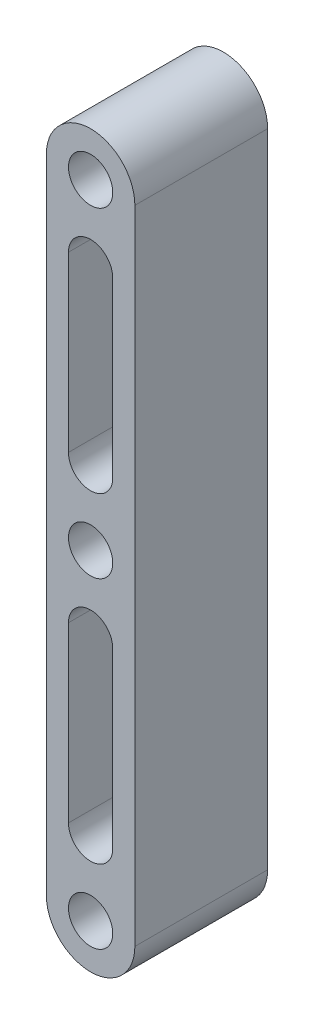
ISO-10303-21;
HEADER;
FILE_DESCRIPTION(('STEP AP214'),'2;1');
FILE_NAME('part.step','',(''),(''),'','','');
FILE_SCHEMA(('AUTOMOTIVE_DESIGN { 1 0 10303 214 1 1 1 1 }'));
ENDSEC;
DATA;
#1=APPLICATION_CONTEXT('core data for automotive mechanical design processes');
#2=APPLICATION_PROTOCOL_DEFINITION('international standard','automotive_design',2000,#1);
#3=PRODUCT_CONTEXT('',#1,'mechanical');
#4=PRODUCT('Part','Part','',(#3));
#5=PRODUCT_RELATED_PRODUCT_CATEGORY('part','',(#4));
#6=PRODUCT_DEFINITION_FORMATION('','',#4);
#7=PRODUCT_DEFINITION_CONTEXT('part definition',#1,'design');
#8=PRODUCT_DEFINITION('design','',#6,#7);
#9=PRODUCT_DEFINITION_SHAPE('','',#8);
#10=(LENGTH_UNIT() NAMED_UNIT(*) SI_UNIT(.MILLI.,.METRE.));
#11=(NAMED_UNIT(*) PLANE_ANGLE_UNIT() SI_UNIT($,.RADIAN.));
#12=(NAMED_UNIT(*) SI_UNIT($,.STERADIAN.) SOLID_ANGLE_UNIT());
#13=UNCERTAINTY_MEASURE_WITH_UNIT(LENGTH_MEASURE(1.E-05),#10,'distance_accuracy_value','');
#14=(GEOMETRIC_REPRESENTATION_CONTEXT(3) GLOBAL_UNCERTAINTY_ASSIGNED_CONTEXT((#13)) GLOBAL_UNIT_ASSIGNED_CONTEXT((#10,
#11,#12)) REPRESENTATION_CONTEXT('',''));
#15=CARTESIAN_POINT('',(0.,0.,0.));
#16=DIRECTION('',(0.,0.,1.));
#17=DIRECTION('',(1.,0.,0.));
#18=AXIS2_PLACEMENT_3D('',#15,#16,#17);
#19=CARTESIAN_POINT('',(0.,0.,9.));
#20=DIRECTION('',(0.,0.,1.));
#21=DIRECTION('',(1.,0.,0.));
#22=AXIS2_PLACEMENT_3D('',#19,#20,#21);
#23=PLANE('',#22);
#24=CARTESIAN_POINT('',(0.,0.,9.));
#25=DIRECTION('',(0.,0.,1.));
#26=DIRECTION('',(1.,0.,0.));
#27=AXIS2_PLACEMENT_3D('',#24,#25,#26);
#28=CIRCLE('',#27,3.);
#29=CARTESIAN_POINT('',(3.,0.,9.));
#30=VERTEX_POINT('',#29);
#31=EDGE_CURVE('E205',#30,#30,#28,.T.);
#32=ORIENTED_EDGE('',*,*,#31,.F.);
#33=EDGE_LOOP('',(#32));
#34=FACE_BOUND('',#33,.T.);
#35=CARTESIAN_POINT('',(0.,0.,9.));
#36=DIRECTION('',(0.,0.,1.));
#37=DIRECTION('',(1.,0.,0.));
#38=AXIS2_PLACEMENT_3D('',#35,#36,#37);
#39=CIRCLE('',#38,6.);
#40=CARTESIAN_POINT('',(6.,0.,9.));
#41=VERTEX_POINT('',#40);
#42=CARTESIAN_POINT('',(-6.,0.,9.));
#43=VERTEX_POINT('',#42);
#44=EDGE_CURVE('E217',#41,#43,#39,.T.);
#45=ORIENTED_EDGE('',*,*,#44,.T.);
#46=DIRECTION('',(0.,-1.,0.));
#47=VECTOR('',#46,1.);
#48=CARTESIAN_POINT('',(-6.,0.,9.));
#49=LINE('',#48,#47);
#50=CARTESIAN_POINT('',(-6.,-87.,9.));
#51=VERTEX_POINT('',#50);
#52=EDGE_CURVE('E220',#43,#51,#49,.T.);
#53=ORIENTED_EDGE('',*,*,#52,.T.);
#54=CARTESIAN_POINT('',(0.,-87.,9.));
#55=DIRECTION('',(0.,0.,1.));
#56=DIRECTION('',(1.,0.,0.));
#57=AXIS2_PLACEMENT_3D('',#54,#55,#56);
#58=CIRCLE('',#57,6.);
#59=CARTESIAN_POINT('',(6.00000000000001,-87.,9.));
#60=VERTEX_POINT('',#59);
#61=EDGE_CURVE('E223',#51,#60,#58,.T.);
#62=ORIENTED_EDGE('',*,*,#61,.T.);
#63=DIRECTION('',(0.,1.,0.));
#64=VECTOR('',#63,1.);
#65=CARTESIAN_POINT('',(6.,0.,9.));
#66=LINE('',#65,#64);
#67=EDGE_CURVE('E225',#60,#41,#66,.T.);
#68=ORIENTED_EDGE('',*,*,#67,.T.);
#69=EDGE_LOOP('',(#45,#53,#62,#68));
#70=FACE_BOUND('',#69,.T.);
#71=CARTESIAN_POINT('',(0.,-87.,9.));
#72=DIRECTION('',(0.,0.,1.));
#73=DIRECTION('',(1.,0.,0.));
#74=AXIS2_PLACEMENT_3D('',#71,#72,#73);
#75=CIRCLE('',#74,3.);
#76=CARTESIAN_POINT('',(3.00000000000001,-87.,9.));
#77=VERTEX_POINT('',#76);
#78=EDGE_CURVE('E211',#77,#77,#75,.T.);
#79=ORIENTED_EDGE('',*,*,#78,.F.);
#80=EDGE_LOOP('',(#79));
#81=FACE_BOUND('',#80,.T.);
#82=CARTESIAN_POINT('',(0.,-43.5,9.));
#83=DIRECTION('',(0.,0.,1.));
#84=DIRECTION('',(1.,0.,0.));
#85=AXIS2_PLACEMENT_3D('',#82,#83,#84);
#86=CIRCLE('',#85,3.);
#87=CARTESIAN_POINT('',(3.00000000000001,-43.5,9.));
#88=VERTEX_POINT('',#87);
#89=EDGE_CURVE('E199',#88,#88,#86,.T.);
#90=ORIENTED_EDGE('',*,*,#89,.F.);
#91=EDGE_LOOP('',(#90));
#92=FACE_BOUND('',#91,.T.);
#93=DIRECTION('',(0.,-1.,0.));
#94=VECTOR('',#93,1.);
#95=CARTESIAN_POINT('',(-3.,-10.,9.));
#96=LINE('',#95,#94);
#97=CARTESIAN_POINT('',(-3.,-10.,9.));
#98=VERTEX_POINT('',#97);
#99=CARTESIAN_POINT('',(-3.,-33.5,9.));
#100=VERTEX_POINT('',#99);
#101=EDGE_CURVE('E170',#98,#100,#96,.T.);
#102=ORIENTED_EDGE('',*,*,#101,.F.);
#103=CARTESIAN_POINT('',(0.,-10.,9.));
#104=DIRECTION('',(0.,0.,1.));
#105=DIRECTION('',(1.,0.,0.));
#106=AXIS2_PLACEMENT_3D('',#103,#104,#105);
#107=CIRCLE('',#106,3.);
#108=CARTESIAN_POINT('',(3.,-10.,9.));
#109=VERTEX_POINT('',#108);
#110=EDGE_CURVE('E168',#109,#98,#107,.T.);
#111=ORIENTED_EDGE('',*,*,#110,.F.);
#112=DIRECTION('',(0.,1.,0.));
#113=VECTOR('',#112,1.);
#114=CARTESIAN_POINT('',(3.,-10.,9.));
#115=LINE('',#114,#113);
#116=CARTESIAN_POINT('',(3.,-33.5,9.));
#117=VERTEX_POINT('',#116);
#118=EDGE_CURVE('E176',#117,#109,#115,.T.);
#119=ORIENTED_EDGE('',*,*,#118,.F.);
#120=CARTESIAN_POINT('',(0.,-33.5,9.));
#121=DIRECTION('',(0.,0.,1.));
#122=DIRECTION('',(1.,0.,0.));
#123=AXIS2_PLACEMENT_3D('',#120,#121,#122);
#124=CIRCLE('',#123,3.);
#125=EDGE_CURVE('E173',#100,#117,#124,.T.);
#126=ORIENTED_EDGE('',*,*,#125,.F.);
#127=EDGE_LOOP('',(#102,#111,#119,#126));
#128=FACE_BOUND('',#127,.T.);
#129=DIRECTION('',(0.,-1.,0.));
#130=VECTOR('',#129,1.);
#131=CARTESIAN_POINT('',(-2.99999999999999,-53.5,9.));
#132=LINE('',#131,#130);
#133=CARTESIAN_POINT('',(-2.99999999999999,-53.5,9.));
#134=VERTEX_POINT('',#133);
#135=CARTESIAN_POINT('',(-2.99999999999999,-77.,9.));
#136=VERTEX_POINT('',#135);
#137=EDGE_CURVE('E140',#134,#136,#132,.T.);
#138=ORIENTED_EDGE('',*,*,#137,.F.);
#139=CARTESIAN_POINT('',(0.,-53.5,9.));
#140=DIRECTION('',(0.,0.,1.));
#141=DIRECTION('',(1.,0.,0.));
#142=AXIS2_PLACEMENT_3D('',#139,#140,#141);
#143=CIRCLE('',#142,3.);
#144=CARTESIAN_POINT('',(3.00000000000001,-53.5,9.));
#145=VERTEX_POINT('',#144);
#146=EDGE_CURVE('E132',#145,#134,#143,.T.);
#147=ORIENTED_EDGE('',*,*,#146,.F.);
#148=DIRECTION('',(0.,1.,0.));
#149=VECTOR('',#148,1.);
#150=CARTESIAN_POINT('',(3.00000000000001,-53.5,9.));
#151=LINE('',#150,#149);
#152=CARTESIAN_POINT('',(3.00000000000001,-77.,9.));
#153=VERTEX_POINT('',#152);
#154=EDGE_CURVE('E154',#153,#145,#151,.T.);
#155=ORIENTED_EDGE('',*,*,#154,.F.);
#156=CARTESIAN_POINT('',(0.,-77.,9.));
#157=DIRECTION('',(0.,0.,1.));
#158=DIRECTION('',(1.,0.,0.));
#159=AXIS2_PLACEMENT_3D('',#156,#157,#158);
#160=CIRCLE('',#159,3.);
#161=EDGE_CURVE('E152',#136,#153,#160,.T.);
#162=ORIENTED_EDGE('',*,*,#161,.F.);
#163=EDGE_LOOP('',(#138,#147,#155,#162));
#164=FACE_BOUND('',#163,.T.);
#165=ADVANCED_FACE('F43',(#34,#70,#81,#92,#128,#164),#23,.T.);
#166=CARTESIAN_POINT('',(0.,0.,-9.));
#167=DIRECTION('',(0.,0.,1.));
#168=DIRECTION('',(1.,0.,0.));
#169=AXIS2_PLACEMENT_3D('',#166,#167,#168);
#170=PLANE('',#169);
#171=CARTESIAN_POINT('',(0.,-10.,-9.));
#172=DIRECTION('',(0.,0.,1.));
#173=DIRECTION('',(1.,0.,0.));
#174=AXIS2_PLACEMENT_3D('',#171,#172,#173);
#175=CIRCLE('',#174,3.);
#176=CARTESIAN_POINT('',(3.,-10.,-9.));
#177=VERTEX_POINT('',#176);
#178=CARTESIAN_POINT('',(-3.,-10.,-9.));
#179=VERTEX_POINT('',#178);
#180=EDGE_CURVE('E148',#177,#179,#175,.T.);
#181=ORIENTED_EDGE('',*,*,#180,.T.);
#182=DIRECTION('',(0.,-1.,0.));
#183=VECTOR('',#182,1.);
#184=CARTESIAN_POINT('',(-3.,-10.,-9.));
#185=LINE('',#184,#183);
#186=CARTESIAN_POINT('',(-3.,-33.5,-9.));
#187=VERTEX_POINT('',#186);
#188=EDGE_CURVE('E181',#179,#187,#185,.T.);
#189=ORIENTED_EDGE('',*,*,#188,.T.);
#190=CARTESIAN_POINT('',(0.,-33.5,-9.));
#191=DIRECTION('',(0.,0.,1.));
#192=DIRECTION('',(1.,0.,0.));
#193=AXIS2_PLACEMENT_3D('',#190,#191,#192);
#194=CIRCLE('',#193,3.);
#195=CARTESIAN_POINT('',(3.,-33.5,-9.));
#196=VERTEX_POINT('',#195);
#197=EDGE_CURVE('E184',#187,#196,#194,.T.);
#198=ORIENTED_EDGE('',*,*,#197,.T.);
#199=DIRECTION('',(0.,1.,0.));
#200=VECTOR('',#199,1.);
#201=CARTESIAN_POINT('',(3.,-10.,-9.));
#202=LINE('',#201,#200);
#203=EDGE_CURVE('E171',#196,#177,#202,.T.);
#204=ORIENTED_EDGE('',*,*,#203,.T.);
#205=EDGE_LOOP('',(#181,#189,#198,#204));
#206=FACE_BOUND('',#205,.T.);
#207=CARTESIAN_POINT('',(0.,0.,-9.));
#208=DIRECTION('',(0.,0.,1.));
#209=DIRECTION('',(1.,0.,0.));
#210=AXIS2_PLACEMENT_3D('',#207,#208,#209);
#211=CIRCLE('',#210,6.);
#212=CARTESIAN_POINT('',(6.,0.,-9.));
#213=VERTEX_POINT('',#212);
#214=CARTESIAN_POINT('',(-6.,0.,-9.));
#215=VERTEX_POINT('',#214);
#216=EDGE_CURVE('E214',#213,#215,#211,.T.);
#217=ORIENTED_EDGE('',*,*,#216,.F.);
#218=DIRECTION('',(0.,1.,0.));
#219=VECTOR('',#218,1.);
#220=CARTESIAN_POINT('',(6.,0.,-9.));
#221=LINE('',#220,#219);
#222=CARTESIAN_POINT('',(6.00000000000001,-87.,-9.));
#223=VERTEX_POINT('',#222);
#224=EDGE_CURVE('E221',#223,#213,#221,.T.);
#225=ORIENTED_EDGE('',*,*,#224,.F.);
#226=CARTESIAN_POINT('',(0.,-87.,-9.));
#227=DIRECTION('',(0.,0.,1.));
#228=DIRECTION('',(1.,0.,0.));
#229=AXIS2_PLACEMENT_3D('',#226,#227,#228);
#230=CIRCLE('',#229,6.);
#231=CARTESIAN_POINT('',(-6.,-87.,-9.));
#232=VERTEX_POINT('',#231);
#233=EDGE_CURVE('E232',#232,#223,#230,.T.);
#234=ORIENTED_EDGE('',*,*,#233,.F.);
#235=DIRECTION('',(0.,-1.,0.));
#236=VECTOR('',#235,1.);
#237=CARTESIAN_POINT('',(-6.,0.,-9.));
#238=LINE('',#237,#236);
#239=EDGE_CURVE('E230',#215,#232,#238,.T.);
#240=ORIENTED_EDGE('',*,*,#239,.F.);
#241=EDGE_LOOP('',(#217,#225,#234,#240));
#242=FACE_BOUND('',#241,.T.);
#243=CARTESIAN_POINT('',(0.,-87.,-9.));
#244=DIRECTION('',(0.,0.,1.));
#245=DIRECTION('',(1.,0.,0.));
#246=AXIS2_PLACEMENT_3D('',#243,#244,#245);
#247=CIRCLE('',#246,3.);
#248=CARTESIAN_POINT('',(3.00000000000001,-87.,-9.));
#249=VERTEX_POINT('',#248);
#250=EDGE_CURVE('E208',#249,#249,#247,.T.);
#251=ORIENTED_EDGE('',*,*,#250,.T.);
#252=EDGE_LOOP('',(#251));
#253=FACE_BOUND('',#252,.T.);
#254=CARTESIAN_POINT('',(0.,0.,-9.));
#255=DIRECTION('',(0.,0.,1.));
#256=DIRECTION('',(1.,0.,0.));
#257=AXIS2_PLACEMENT_3D('',#254,#255,#256);
#258=CIRCLE('',#257,3.);
#259=CARTESIAN_POINT('',(3.,0.,-9.));
#260=VERTEX_POINT('',#259);
#261=EDGE_CURVE('E202',#260,#260,#258,.T.);
#262=ORIENTED_EDGE('',*,*,#261,.T.);
#263=EDGE_LOOP('',(#262));
#264=FACE_BOUND('',#263,.T.);
#265=CARTESIAN_POINT('',(0.,-43.5,-9.));
#266=DIRECTION('',(0.,0.,1.));
#267=DIRECTION('',(1.,0.,0.));
#268=AXIS2_PLACEMENT_3D('',#265,#266,#267);
#269=CIRCLE('',#268,3.);
#270=CARTESIAN_POINT('',(3.00000000000001,-43.5,-9.));
#271=VERTEX_POINT('',#270);
#272=EDGE_CURVE('E198',#271,#271,#269,.T.);
#273=ORIENTED_EDGE('',*,*,#272,.T.);
#274=EDGE_LOOP('',(#273));
#275=FACE_BOUND('',#274,.T.);
#276=CARTESIAN_POINT('',(0.,-53.5,-9.));
#277=DIRECTION('',(0.,0.,1.));
#278=DIRECTION('',(1.,0.,0.));
#279=AXIS2_PLACEMENT_3D('',#276,#277,#278);
#280=CIRCLE('',#279,3.);
#281=CARTESIAN_POINT('',(3.00000000000001,-53.5,-9.));
#282=VERTEX_POINT('',#281);
#283=CARTESIAN_POINT('',(-2.99999999999999,-53.5,-9.));
#284=VERTEX_POINT('',#283);
#285=EDGE_CURVE('E66',#282,#284,#280,.T.);
#286=ORIENTED_EDGE('',*,*,#285,.T.);
#287=DIRECTION('',(0.,-1.,0.));
#288=VECTOR('',#287,1.);
#289=CARTESIAN_POINT('',(-2.99999999999999,-53.5,-9.));
#290=LINE('',#289,#288);
#291=CARTESIAN_POINT('',(-2.99999999999999,-77.,-9.));
#292=VERTEX_POINT('',#291);
#293=EDGE_CURVE('E147',#284,#292,#290,.T.);
#294=ORIENTED_EDGE('',*,*,#293,.T.);
#295=CARTESIAN_POINT('',(0.,-77.,-9.));
#296=DIRECTION('',(0.,0.,1.));
#297=DIRECTION('',(1.,0.,0.));
#298=AXIS2_PLACEMENT_3D('',#295,#296,#297);
#299=CIRCLE('',#298,3.);
#300=CARTESIAN_POINT('',(3.00000000000001,-77.,-9.));
#301=VERTEX_POINT('',#300);
#302=EDGE_CURVE('E160',#292,#301,#299,.T.);
#303=ORIENTED_EDGE('',*,*,#302,.T.);
#304=DIRECTION('',(0.,1.,0.));
#305=VECTOR('',#304,1.);
#306=CARTESIAN_POINT('',(3.00000000000001,-53.5,-9.));
#307=LINE('',#306,#305);
#308=EDGE_CURVE('E141',#301,#282,#307,.T.);
#309=ORIENTED_EDGE('',*,*,#308,.T.);
#310=EDGE_LOOP('',(#286,#294,#303,#309));
#311=FACE_BOUND('',#310,.T.);
#312=ADVANCED_FACE('F250',(#206,#242,#253,#264,#275,#311),#170,.F.);
#313=CARTESIAN_POINT('',(0.,0.,9.));
#314=DIRECTION('',(0.,0.,-1.));
#315=DIRECTION('',(-1.,0.,0.));
#316=AXIS2_PLACEMENT_3D('',#313,#314,#315);
#317=CYLINDRICAL_SURFACE('',#316,6.);
#318=ORIENTED_EDGE('',*,*,#216,.T.);
#319=DIRECTION('',(0.,0.,-1.));
#320=VECTOR('',#319,1.);
#321=CARTESIAN_POINT('',(-6.,0.,9.));
#322=LINE('',#321,#320);
#323=EDGE_CURVE('E11',#43,#215,#322,.T.);
#324=ORIENTED_EDGE('',*,*,#323,.F.);
#325=ORIENTED_EDGE('',*,*,#44,.F.);
#326=DIRECTION('',(0.,0.,-1.));
#327=VECTOR('',#326,1.);
#328=CARTESIAN_POINT('',(6.,0.,9.));
#329=LINE('',#328,#327);
#330=EDGE_CURVE('E227',#41,#213,#329,.T.);
#331=ORIENTED_EDGE('',*,*,#330,.T.);
#332=EDGE_LOOP('',(#318,#324,#325,#331));
#333=FACE_BOUND('',#332,.T.);
#334=ADVANCED_FACE('F45',(#333),#317,.T.);
#335=CARTESIAN_POINT('',(-6.,0.,9.));
#336=DIRECTION('',(1.,0.,0.));
#337=DIRECTION('',(0.,1.,0.));
#338=AXIS2_PLACEMENT_3D('',#335,#336,#337);
#339=PLANE('',#338);
#340=ORIENTED_EDGE('',*,*,#239,.T.);
#341=DIRECTION('',(0.,0.,-1.));
#342=VECTOR('',#341,1.);
#343=CARTESIAN_POINT('',(-6.,-87.,9.));
#344=LINE('',#343,#342);
#345=EDGE_CURVE('E51',#51,#232,#344,.T.);
#346=ORIENTED_EDGE('',*,*,#345,.F.);
#347=ORIENTED_EDGE('',*,*,#52,.F.);
#348=ORIENTED_EDGE('',*,*,#323,.T.);
#349=EDGE_LOOP('',(#340,#346,#347,#348));
#350=FACE_BOUND('',#349,.T.);
#351=ADVANCED_FACE('F261',(#350),#339,.F.);
#352=CARTESIAN_POINT('',(0.,-87.,9.));
#353=DIRECTION('',(0.,0.,-1.));
#354=DIRECTION('',(-1.,0.,0.));
#355=AXIS2_PLACEMENT_3D('',#352,#353,#354);
#356=CYLINDRICAL_SURFACE('',#355,6.);
#357=ORIENTED_EDGE('',*,*,#233,.T.);
#358=DIRECTION('',(0.,0.,-1.));
#359=VECTOR('',#358,1.);
#360=CARTESIAN_POINT('',(6.00000000000001,-87.,9.));
#361=LINE('',#360,#359);
#362=EDGE_CURVE('E237',#60,#223,#361,.T.);
#363=ORIENTED_EDGE('',*,*,#362,.F.);
#364=ORIENTED_EDGE('',*,*,#61,.F.);
#365=ORIENTED_EDGE('',*,*,#345,.T.);
#366=EDGE_LOOP('',(#357,#363,#364,#365));
#367=FACE_BOUND('',#366,.T.);
#368=ADVANCED_FACE('F244',(#367),#356,.T.);
#369=CARTESIAN_POINT('',(6.,0.,9.));
#370=DIRECTION('',(-1.,0.,0.));
#371=DIRECTION('',(0.,-1.,0.));
#372=AXIS2_PLACEMENT_3D('',#369,#370,#371);
#373=PLANE('',#372);
#374=ORIENTED_EDGE('',*,*,#224,.T.);
#375=ORIENTED_EDGE('',*,*,#330,.F.);
#376=ORIENTED_EDGE('',*,*,#67,.F.);
#377=ORIENTED_EDGE('',*,*,#362,.T.);
#378=EDGE_LOOP('',(#374,#375,#376,#377));
#379=FACE_BOUND('',#378,.T.);
#380=ADVANCED_FACE('F254',(#379),#373,.F.);
#381=CARTESIAN_POINT('',(0.,-87.,9.));
#382=DIRECTION('',(0.,0.,-1.));
#383=DIRECTION('',(-1.,0.,0.));
#384=AXIS2_PLACEMENT_3D('',#381,#382,#383);
#385=CYLINDRICAL_SURFACE('',#384,3.);
#386=ORIENTED_EDGE('',*,*,#78,.T.);
#387=EDGE_LOOP('',(#386));
#388=FACE_BOUND('',#387,.T.);
#389=ORIENTED_EDGE('',*,*,#250,.F.);
#390=EDGE_LOOP('',(#389));
#391=FACE_BOUND('',#390,.T.);
#392=ADVANCED_FACE('F278',(#388,#391),#385,.F.);
#393=CARTESIAN_POINT('',(0.,0.,9.));
#394=DIRECTION('',(0.,0.,-1.));
#395=DIRECTION('',(-1.,0.,0.));
#396=AXIS2_PLACEMENT_3D('',#393,#394,#395);
#397=CYLINDRICAL_SURFACE('',#396,3.);
#398=ORIENTED_EDGE('',*,*,#31,.T.);
#399=EDGE_LOOP('',(#398));
#400=FACE_BOUND('',#399,.T.);
#401=ORIENTED_EDGE('',*,*,#261,.F.);
#402=EDGE_LOOP('',(#401));
#403=FACE_BOUND('',#402,.T.);
#404=ADVANCED_FACE('F285',(#400,#403),#397,.F.);
#405=CARTESIAN_POINT('',(0.,-43.5,9.));
#406=DIRECTION('',(0.,0.,-1.));
#407=DIRECTION('',(-1.,0.,0.));
#408=AXIS2_PLACEMENT_3D('',#405,#406,#407);
#409=CYLINDRICAL_SURFACE('',#408,3.);
#410=ORIENTED_EDGE('',*,*,#89,.T.);
#411=EDGE_LOOP('',(#410));
#412=FACE_BOUND('',#411,.T.);
#413=ORIENTED_EDGE('',*,*,#272,.F.);
#414=EDGE_LOOP('',(#413));
#415=FACE_BOUND('',#414,.T.);
#416=ADVANCED_FACE('F290',(#412,#415),#409,.F.);
#417=CARTESIAN_POINT('',(0.,-10.,9.));
#418=DIRECTION('',(0.,0.,-1.));
#419=DIRECTION('',(-1.,0.,0.));
#420=AXIS2_PLACEMENT_3D('',#417,#418,#419);
#421=CYLINDRICAL_SURFACE('',#420,3.);
#422=ORIENTED_EDGE('',*,*,#180,.F.);
#423=DIRECTION('',(0.,0.,-1.));
#424=VECTOR('',#423,1.);
#425=CARTESIAN_POINT('',(3.,-10.,9.));
#426=LINE('',#425,#424);
#427=EDGE_CURVE('E178',#109,#177,#426,.T.);
#428=ORIENTED_EDGE('',*,*,#427,.F.);
#429=ORIENTED_EDGE('',*,*,#110,.T.);
#430=DIRECTION('',(0.,0.,-1.));
#431=VECTOR('',#430,1.);
#432=CARTESIAN_POINT('',(-3.,-10.,9.));
#433=LINE('',#432,#431);
#434=EDGE_CURVE('E195',#98,#179,#433,.T.);
#435=ORIENTED_EDGE('',*,*,#434,.T.);
#436=EDGE_LOOP('',(#422,#428,#429,#435));
#437=FACE_BOUND('',#436,.T.);
#438=ADVANCED_FACE('F326',(#437),#421,.F.);
#439=CARTESIAN_POINT('',(-3.,-10.,9.));
#440=DIRECTION('',(1.,0.,0.));
#441=DIRECTION('',(0.,1.,0.));
#442=AXIS2_PLACEMENT_3D('',#439,#440,#441);
#443=PLANE('',#442);
#444=ORIENTED_EDGE('',*,*,#188,.F.);
#445=ORIENTED_EDGE('',*,*,#434,.F.);
#446=ORIENTED_EDGE('',*,*,#101,.T.);
#447=DIRECTION('',(0.,0.,-1.));
#448=VECTOR('',#447,1.);
#449=CARTESIAN_POINT('',(-3.,-33.5,9.));
#450=LINE('',#449,#448);
#451=EDGE_CURVE('E193',#100,#187,#450,.T.);
#452=ORIENTED_EDGE('',*,*,#451,.T.);
#453=EDGE_LOOP('',(#444,#445,#446,#452));
#454=FACE_BOUND('',#453,.T.);
#455=ADVANCED_FACE('F322',(#454),#443,.T.);
#456=CARTESIAN_POINT('',(0.,-33.5,9.));
#457=DIRECTION('',(0.,0.,-1.));
#458=DIRECTION('',(-1.,0.,0.));
#459=AXIS2_PLACEMENT_3D('',#456,#457,#458);
#460=CYLINDRICAL_SURFACE('',#459,3.);
#461=ORIENTED_EDGE('',*,*,#197,.F.);
#462=ORIENTED_EDGE('',*,*,#451,.F.);
#463=ORIENTED_EDGE('',*,*,#125,.T.);
#464=DIRECTION('',(0.,0.,-1.));
#465=VECTOR('',#464,1.);
#466=CARTESIAN_POINT('',(3.,-33.5,9.));
#467=LINE('',#466,#465);
#468=EDGE_CURVE('E191',#117,#196,#467,.T.);
#469=ORIENTED_EDGE('',*,*,#468,.T.);
#470=EDGE_LOOP('',(#461,#462,#463,#469));
#471=FACE_BOUND('',#470,.T.);
#472=ADVANCED_FACE('F318',(#471),#460,.F.);
#473=CARTESIAN_POINT('',(3.,-10.,9.));
#474=DIRECTION('',(-1.,0.,0.));
#475=DIRECTION('',(0.,-1.,0.));
#476=AXIS2_PLACEMENT_3D('',#473,#474,#475);
#477=PLANE('',#476);
#478=ORIENTED_EDGE('',*,*,#203,.F.);
#479=ORIENTED_EDGE('',*,*,#468,.F.);
#480=ORIENTED_EDGE('',*,*,#118,.T.);
#481=ORIENTED_EDGE('',*,*,#427,.T.);
#482=EDGE_LOOP('',(#478,#479,#480,#481));
#483=FACE_BOUND('',#482,.T.);
#484=ADVANCED_FACE('F315',(#483),#477,.T.);
#485=CARTESIAN_POINT('',(0.,-53.5,9.));
#486=DIRECTION('',(0.,0.,-1.));
#487=DIRECTION('',(-1.,0.,0.));
#488=AXIS2_PLACEMENT_3D('',#485,#486,#487);
#489=CYLINDRICAL_SURFACE('',#488,3.);
#490=ORIENTED_EDGE('',*,*,#285,.F.);
#491=DIRECTION('',(0.,0.,-1.));
#492=VECTOR('',#491,1.);
#493=CARTESIAN_POINT('',(3.00000000000001,-53.5,9.));
#494=LINE('',#493,#492);
#495=EDGE_CURVE('E136',#145,#282,#494,.T.);
#496=ORIENTED_EDGE('',*,*,#495,.F.);
#497=ORIENTED_EDGE('',*,*,#146,.T.);
#498=DIRECTION('',(0.,0.,-1.));
#499=VECTOR('',#498,1.);
#500=CARTESIAN_POINT('',(-2.99999999999999,-53.5,9.));
#501=LINE('',#500,#499);
#502=EDGE_CURVE('E135',#134,#284,#501,.T.);
#503=ORIENTED_EDGE('',*,*,#502,.T.);
#504=EDGE_LOOP('',(#490,#496,#497,#503));
#505=FACE_BOUND('',#504,.T.);
#506=ADVANCED_FACE('F134',(#505),#489,.F.);
#507=CARTESIAN_POINT('',(-2.99999999999999,-53.5,9.));
#508=DIRECTION('',(1.,0.,0.));
#509=DIRECTION('',(0.,1.,0.));
#510=AXIS2_PLACEMENT_3D('',#507,#508,#509);
#511=PLANE('',#510);
#512=ORIENTED_EDGE('',*,*,#293,.F.);
#513=ORIENTED_EDGE('',*,*,#502,.F.);
#514=ORIENTED_EDGE('',*,*,#137,.T.);
#515=DIRECTION('',(0.,0.,-1.));
#516=VECTOR('',#515,1.);
#517=CARTESIAN_POINT('',(-2.99999999999999,-77.,9.));
#518=LINE('',#517,#516);
#519=EDGE_CURVE('E149',#136,#292,#518,.T.);
#520=ORIENTED_EDGE('',*,*,#519,.T.);
#521=EDGE_LOOP('',(#512,#513,#514,#520));
#522=FACE_BOUND('',#521,.T.);
#523=ADVANCED_FACE('F144',(#522),#511,.T.);
#524=CARTESIAN_POINT('',(0.,-77.,9.));
#525=DIRECTION('',(0.,0.,-1.));
#526=DIRECTION('',(-1.,0.,0.));
#527=AXIS2_PLACEMENT_3D('',#524,#525,#526);
#528=CYLINDRICAL_SURFACE('',#527,3.);
#529=ORIENTED_EDGE('',*,*,#302,.F.);
#530=ORIENTED_EDGE('',*,*,#519,.F.);
#531=ORIENTED_EDGE('',*,*,#161,.T.);
#532=DIRECTION('',(0.,0.,-1.));
#533=VECTOR('',#532,1.);
#534=CARTESIAN_POINT('',(3.00000000000001,-77.,9.));
#535=LINE('',#534,#533);
#536=EDGE_CURVE('E58',#153,#301,#535,.T.);
#537=ORIENTED_EDGE('',*,*,#536,.T.);
#538=EDGE_LOOP('',(#529,#530,#531,#537));
#539=FACE_BOUND('',#538,.T.);
#540=ADVANCED_FACE('F303',(#539),#528,.F.);
#541=CARTESIAN_POINT('',(3.00000000000001,-53.5,9.));
#542=DIRECTION('',(-1.,0.,0.));
#543=DIRECTION('',(0.,-1.,0.));
#544=AXIS2_PLACEMENT_3D('',#541,#542,#543);
#545=PLANE('',#544);
#546=ORIENTED_EDGE('',*,*,#308,.F.);
#547=ORIENTED_EDGE('',*,*,#536,.F.);
#548=ORIENTED_EDGE('',*,*,#154,.T.);
#549=ORIENTED_EDGE('',*,*,#495,.T.);
#550=EDGE_LOOP('',(#546,#547,#548,#549));
#551=FACE_BOUND('',#550,.T.);
#552=ADVANCED_FACE('F301',(#551),#545,.T.);
#553=CLOSED_SHELL('',(#165,#312,#334,#351,#368,#380,#392,#404,#416,#438,#455,#472,#484,#506,
#523,#540,#552));
#554=MANIFOLD_SOLID_BREP('B2',#553);
#555=ADVANCED_BREP_SHAPE_REPRESENTATION('',(#18,#554),#14);
#556=SHAPE_DEFINITION_REPRESENTATION(#9,#555);
ENDSEC;
END-ISO-10303-21;
